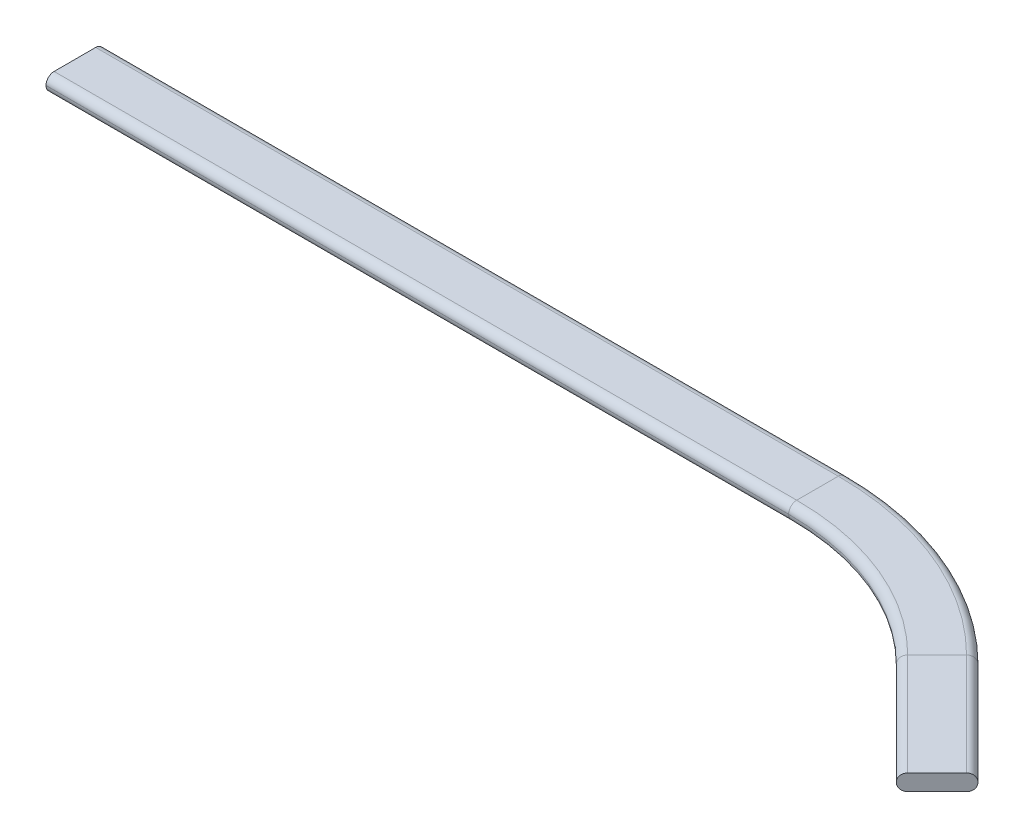
ISO-10303-21;
HEADER;
FILE_DESCRIPTION(('STEP AP214'),'2;1');
FILE_NAME('part.step','',(''),(''),'','','');
FILE_SCHEMA(('AUTOMOTIVE_DESIGN { 1 0 10303 214 1 1 1 1 }'));
ENDSEC;
DATA;
#1=APPLICATION_CONTEXT('core data for automotive mechanical design processes');
#2=APPLICATION_PROTOCOL_DEFINITION('international standard','automotive_design',2000,#1);
#3=PRODUCT_CONTEXT('',#1,'mechanical');
#4=PRODUCT('Part','Part','',(#3));
#5=PRODUCT_RELATED_PRODUCT_CATEGORY('part','',(#4));
#6=PRODUCT_DEFINITION_FORMATION('','',#4);
#7=PRODUCT_DEFINITION_CONTEXT('part definition',#1,'design');
#8=PRODUCT_DEFINITION('design','',#6,#7);
#9=PRODUCT_DEFINITION_SHAPE('','',#8);
#10=(LENGTH_UNIT() NAMED_UNIT(*) SI_UNIT(.MILLI.,.METRE.));
#11=(NAMED_UNIT(*) PLANE_ANGLE_UNIT() SI_UNIT($,.RADIAN.));
#12=(NAMED_UNIT(*) SI_UNIT($,.STERADIAN.) SOLID_ANGLE_UNIT());
#13=UNCERTAINTY_MEASURE_WITH_UNIT(LENGTH_MEASURE(1.E-05),#10,'distance_accuracy_value','');
#14=(GEOMETRIC_REPRESENTATION_CONTEXT(3) GLOBAL_UNCERTAINTY_ASSIGNED_CONTEXT((#13)) GLOBAL_UNIT_ASSIGNED_CONTEXT((#10,
#11,#12)) REPRESENTATION_CONTEXT('',''));
#15=CARTESIAN_POINT('',(0.,0.,0.));
#16=DIRECTION('',(0.,0.,1.));
#17=DIRECTION('',(1.,0.,0.));
#18=AXIS2_PLACEMENT_3D('',#15,#16,#17);
#19=CARTESIAN_POINT('',(0.,-1.495,-0.3));
#20=DIRECTION('',(0.,0.,1.));
#21=DIRECTION('',(1.,0.,0.));
#22=AXIS2_PLACEMENT_3D('',#19,#20,#21);
#23=CYLINDRICAL_SURFACE('',#22,0.5);
#24=CARTESIAN_POINT('',(0.,-1.495,0.3));
#25=DIRECTION('',(0.,0.,1.));
#26=DIRECTION('',(-1.,0.,0.));
#27=AXIS2_PLACEMENT_3D('',#24,#25,#26);
#28=CIRCLE('',#27,0.5);
#29=CARTESIAN_POINT('',(0.,-0.995,0.3));
#30=VERTEX_POINT('',#29);
#31=CARTESIAN_POINT('',(0.302042669776583,-1.89345981683758,0.3));
#32=VERTEX_POINT('',#31);
#33=EDGE_CURVE('E100',#30,#32,#28,.T.);
#34=ORIENTED_EDGE('',*,*,#33,.F.);
#35=DIRECTION('',(0.,0.,1.));
#36=VECTOR('',#35,1.);
#37=CARTESIAN_POINT('',(0.,-0.995,-0.3));
#38=LINE('',#37,#36);
#39=CARTESIAN_POINT('',(0.,-0.995,-0.3));
#40=VERTEX_POINT('',#39);
#41=EDGE_CURVE('E12',#40,#30,#38,.T.);
#42=ORIENTED_EDGE('',*,*,#41,.F.);
#43=CARTESIAN_POINT('',(0.,-1.495,-0.3));
#44=DIRECTION('',(0.,0.,1.));
#45=DIRECTION('',(-1.,0.,0.));
#46=AXIS2_PLACEMENT_3D('',#43,#44,#45);
#47=CIRCLE('',#46,0.5);
#48=CARTESIAN_POINT('',(0.302042669776583,-1.89345981683758,-0.3));
#49=VERTEX_POINT('',#48);
#50=EDGE_CURVE('E89',#40,#49,#47,.T.);
#51=ORIENTED_EDGE('',*,*,#50,.T.);
#52=DIRECTION('',(0.,0.,1.));
#53=VECTOR('',#52,1.);
#54=CARTESIAN_POINT('',(0.302042669776583,-1.89345981683758,-0.3));
#55=LINE('',#54,#53);
#56=EDGE_CURVE('E48',#49,#32,#55,.T.);
#57=ORIENTED_EDGE('',*,*,#56,.T.);
#58=EDGE_LOOP('',(#34,#42,#51,#57));
#59=FACE_BOUND('',#58,.T.);
#60=ADVANCED_FACE('F45',(#59),#23,.T.);
#61=CARTESIAN_POINT('',(1.48730611059384,-0.995,-0.3));
#62=DIRECTION('',(0.,1.,0.));
#63=DIRECTION('',(0.,0.,1.));
#64=AXIS2_PLACEMENT_3D('',#61,#62,#63);
#65=PLANE('',#64);
#66=DIRECTION('',(-1.,0.,0.));
#67=VECTOR('',#66,1.);
#68=CARTESIAN_POINT('',(1.48730611059384,-0.995,0.3));
#69=LINE('',#68,#67);
#70=CARTESIAN_POINT('',(1.48730611059384,-0.995,0.3));
#71=VERTEX_POINT('',#70);
#72=EDGE_CURVE('E91',#71,#30,#69,.T.);
#73=ORIENTED_EDGE('',*,*,#72,.F.);
#74=DIRECTION('',(0.,0.,1.));
#75=VECTOR('',#74,1.);
#76=CARTESIAN_POINT('',(1.48730611059384,-0.995,-0.3));
#77=LINE('',#76,#75);
#78=CARTESIAN_POINT('',(1.48730611059384,-0.995,-0.3));
#79=VERTEX_POINT('',#78);
#80=EDGE_CURVE('E54',#79,#71,#77,.T.);
#81=ORIENTED_EDGE('',*,*,#80,.F.);
#82=DIRECTION('',(-1.,0.,0.));
#83=VECTOR('',#82,1.);
#84=CARTESIAN_POINT('',(1.48730611059384,-0.995,-0.3));
#85=LINE('',#84,#83);
#86=EDGE_CURVE('E86',#79,#40,#85,.T.);
#87=ORIENTED_EDGE('',*,*,#86,.T.);
#88=ORIENTED_EDGE('',*,*,#41,.T.);
#89=EDGE_LOOP('',(#73,#81,#87,#88));
#90=FACE_BOUND('',#89,.T.);
#91=ADVANCED_FACE('F105',(#90),#65,.T.);
#92=CARTESIAN_POINT('',(0.302042669776583,-1.89345981683758,-0.3));
#93=DIRECTION('',(0.604085339553166,-0.796919633675151,0.));
#94=DIRECTION('',(0.796919633675151,0.604085339553166,0.));
#95=AXIS2_PLACEMENT_3D('',#92,#93,#94);
#96=PLANE('',#95);
#97=DIRECTION('',(0.796919633675151,0.604085339553166,0.));
#98=VECTOR('',#97,1.);
#99=CARTESIAN_POINT('',(0.302042669776583,-1.89345981683758,0.3));
#100=LINE('',#99,#98);
#101=EDGE_CURVE('E84',#32,#71,#100,.T.);
#102=ORIENTED_EDGE('',*,*,#101,.F.);
#103=ORIENTED_EDGE('',*,*,#56,.F.);
#104=DIRECTION('',(0.796919633675151,0.604085339553166,0.));
#105=VECTOR('',#104,1.);
#106=CARTESIAN_POINT('',(0.302042669776583,-1.89345981683758,-0.3));
#107=LINE('',#106,#105);
#108=EDGE_CURVE('E82',#49,#79,#107,.T.);
#109=ORIENTED_EDGE('',*,*,#108,.T.);
#110=ORIENTED_EDGE('',*,*,#80,.T.);
#111=EDGE_LOOP('',(#102,#103,#109,#110));
#112=FACE_BOUND('',#111,.T.);
#113=ADVANCED_FACE('F81',(#112),#96,.T.);
#114=CARTESIAN_POINT('',(0.,-1.495,-0.3));
#115=DIRECTION('',(0.,0.,-1.));
#116=DIRECTION('',(-1.,0.,0.));
#117=AXIS2_PLACEMENT_3D('',#114,#115,#116);
#118=PLANE('',#117);
#119=CARTESIAN_POINT('',(0.,-1.495,-0.3));
#120=DIRECTION('',(0.,0.,1.));
#121=DIRECTION('',(-1.,0.,0.));
#122=AXIS2_PLACEMENT_3D('',#119,#120,#121);
#123=CIRCLE('',#122,0.25);
#124=CARTESIAN_POINT('',(-0.25,-1.495,-0.3));
#125=VERTEX_POINT('',#124);
#126=EDGE_CURVE('E102',#125,#125,#123,.T.);
#127=ORIENTED_EDGE('',*,*,#126,.T.);
#128=EDGE_LOOP('',(#127));
#129=FACE_BOUND('',#128,.T.);
#130=ORIENTED_EDGE('',*,*,#50,.F.);
#131=ORIENTED_EDGE('',*,*,#86,.F.);
#132=ORIENTED_EDGE('',*,*,#108,.F.);
#133=EDGE_LOOP('',(#130,#131,#132));
#134=FACE_BOUND('',#133,.T.);
#135=ADVANCED_FACE('F88',(#129,#134),#118,.T.);
#136=CARTESIAN_POINT('',(0.,-1.495,0.3));
#137=DIRECTION('',(0.,0.,-1.));
#138=DIRECTION('',(-1.,0.,0.));
#139=AXIS2_PLACEMENT_3D('',#136,#137,#138);
#140=PLANE('',#139);
#141=CARTESIAN_POINT('',(0.,-1.495,0.3));
#142=DIRECTION('',(0.,0.,1.));
#143=DIRECTION('',(-1.,0.,0.));
#144=AXIS2_PLACEMENT_3D('',#141,#142,#143);
#145=CIRCLE('',#144,0.25);
#146=CARTESIAN_POINT('',(-0.25,-1.495,0.3));
#147=VERTEX_POINT('',#146);
#148=EDGE_CURVE('E96',#147,#147,#145,.T.);
#149=ORIENTED_EDGE('',*,*,#148,.F.);
#150=EDGE_LOOP('',(#149));
#151=FACE_BOUND('',#150,.T.);
#152=ORIENTED_EDGE('',*,*,#33,.T.);
#153=ORIENTED_EDGE('',*,*,#101,.T.);
#154=ORIENTED_EDGE('',*,*,#72,.T.);
#155=EDGE_LOOP('',(#152,#153,#154));
#156=FACE_BOUND('',#155,.T.);
#157=ADVANCED_FACE('F104',(#151,#156),#140,.F.);
#158=CARTESIAN_POINT('',(0.,-1.495,-0.3));
#159=DIRECTION('',(0.,0.,1.));
#160=DIRECTION('',(1.,0.,0.));
#161=AXIS2_PLACEMENT_3D('',#158,#159,#160);
#162=CYLINDRICAL_SURFACE('',#161,0.25);
#163=ORIENTED_EDGE('',*,*,#126,.F.);
#164=EDGE_LOOP('',(#163));
#165=FACE_BOUND('',#164,.T.);
#166=ORIENTED_EDGE('',*,*,#148,.T.);
#167=EDGE_LOOP('',(#166));
#168=FACE_BOUND('',#167,.T.);
#169=ADVANCED_FACE('F115',(#165,#168),#162,.F.);
#170=CLOSED_SHELL('',(#60,#91,#113,#135,#157,#169));
#171=MANIFOLD_SOLID_BREP('B2',#170);
#172=CARTESIAN_POINT('',(0.,0.,0.));
#173=DIRECTION('',(1.,0.,0.));
#174=DIRECTION('',(0.,0.,-1.));
#175=AXIS2_PLACEMENT_3D('',#172,#173,#174);
#176=PLANE('',#175);
#177=DIRECTION('',(0.,0.,-1.));
#178=VECTOR('',#177,1.);
#179=CARTESIAN_POINT('',(0.,-0.985,-3.5));
#180=LINE('',#179,#178);
#181=CARTESIAN_POINT('',(0.,-0.984999999999999,2.52));
#182=VERTEX_POINT('',#181);
#183=CARTESIAN_POINT('',(0.,-0.985,-2.52));
#184=VERTEX_POINT('',#183);
#185=EDGE_CURVE('E411',#182,#184,#180,.T.);
#186=ORIENTED_EDGE('',*,*,#185,.F.);
#187=CARTESIAN_POINT('',(0.,-0.0049999999999998,2.52));
#188=DIRECTION('',(1.,0.,0.));
#189=DIRECTION('',(0.,0.,-1.));
#190=AXIS2_PLACEMENT_3D('',#187,#188,#189);
#191=CIRCLE('',#190,0.98);
#192=CARTESIAN_POINT('',(0.,-0.0049999999999998,3.5));
#193=VERTEX_POINT('',#192);
#194=EDGE_CURVE('E359',#182,#193,#191,.F.);
#195=ORIENTED_EDGE('',*,*,#194,.T.);
#196=DIRECTION('',(0.,-1.,0.));
#197=VECTOR('',#196,1.);
#198=CARTESIAN_POINT('',(0.,-0.984999999999999,3.5));
#199=LINE('',#198,#197);
#200=CARTESIAN_POINT('',(0.,0.00500000000000045,3.5));
#201=VERTEX_POINT('',#200);
#202=EDGE_CURVE('E408',#201,#193,#199,.T.);
#203=ORIENTED_EDGE('',*,*,#202,.F.);
#204=CARTESIAN_POINT('',(0.,0.00500000000000045,2.52));
#205=DIRECTION('',(1.,0.,0.));
#206=DIRECTION('',(0.,0.,-1.));
#207=AXIS2_PLACEMENT_3D('',#204,#205,#206);
#208=CIRCLE('',#207,0.98);
#209=CARTESIAN_POINT('',(0.,0.985,2.52));
#210=VERTEX_POINT('',#209);
#211=EDGE_CURVE('E357',#201,#210,#208,.F.);
#212=ORIENTED_EDGE('',*,*,#211,.T.);
#213=DIRECTION('',(0.,0.,1.));
#214=VECTOR('',#213,1.);
#215=CARTESIAN_POINT('',(0.,0.985,-3.5));
#216=LINE('',#215,#214);
#217=CARTESIAN_POINT('',(0.,0.985,-2.52));
#218=VERTEX_POINT('',#217);
#219=EDGE_CURVE('E401',#218,#210,#216,.T.);
#220=ORIENTED_EDGE('',*,*,#219,.F.);
#221=CARTESIAN_POINT('',(0.,0.00500000000000023,-2.52));
#222=DIRECTION('',(1.,0.,0.));
#223=DIRECTION('',(0.,0.,-1.));
#224=AXIS2_PLACEMENT_3D('',#221,#222,#223);
#225=CIRCLE('',#224,0.98);
#226=CARTESIAN_POINT('',(0.,0.00500000000000023,-3.5));
#227=VERTEX_POINT('',#226);
#228=EDGE_CURVE('E181',#218,#227,#225,.F.);
#229=ORIENTED_EDGE('',*,*,#228,.T.);
#230=DIRECTION('',(0.,1.,0.));
#231=VECTOR('',#230,1.);
#232=CARTESIAN_POINT('',(0.,-0.985,-3.5));
#233=LINE('',#232,#231);
#234=CARTESIAN_POINT('',(0.,-0.00500000000000001,-3.5));
#235=VERTEX_POINT('',#234);
#236=EDGE_CURVE('E373',#235,#227,#233,.T.);
#237=ORIENTED_EDGE('',*,*,#236,.F.);
#238=CARTESIAN_POINT('',(0.,-0.00499999999999995,-2.52));
#239=DIRECTION('',(1.,0.,0.));
#240=DIRECTION('',(0.,0.,-1.));
#241=AXIS2_PLACEMENT_3D('',#238,#239,#240);
#242=CIRCLE('',#241,0.98);
#243=EDGE_CURVE('E355',#235,#184,#242,.F.);
#244=ORIENTED_EDGE('',*,*,#243,.T.);
#245=EDGE_LOOP('',(#186,#195,#203,#212,#220,#229,#237,#244));
#246=FACE_BOUND('',#245,.T.);
#247=ADVANCED_FACE('F164',(#246),#176,.F.);
#248=CARTESIAN_POINT('',(127.130929640481,0.,22.6334549574227));
#249=DIRECTION('',(0.707106781186547,0.,0.707106781186548));
#250=DIRECTION('',(0.707106781186548,0.,-0.707106781186547));
#251=AXIS2_PLACEMENT_3D('',#248,#249,#250);
#252=PLANE('',#251);
#253=DIRECTION('',(0.,-1.,0.));
#254=VECTOR('',#253,1.);
#255=CARTESIAN_POINT('',(124.656055906328,-0.984999999999999,25.1083286915756));
#256=LINE('',#255,#254);
#257=CARTESIAN_POINT('',(124.656055906328,0.00500000000000023,25.1083286915756));
#258=VERTEX_POINT('',#257);
#259=CARTESIAN_POINT('',(124.656055906328,-0.00499999999999936,25.1083286915756));
#260=VERTEX_POINT('',#259);
#261=EDGE_CURVE('E282',#258,#260,#256,.T.);
#262=ORIENTED_EDGE('',*,*,#261,.T.);
#263=CARTESIAN_POINT('',(125.349020551891,-0.00499999999999936,24.4153640460128));
#264=DIRECTION('',(0.707106781186547,0.,0.707106781186548));
#265=DIRECTION('',(0.707106781186548,0.,-0.707106781186547));
#266=AXIS2_PLACEMENT_3D('',#263,#264,#265);
#267=CIRCLE('',#266,0.98);
#268=CARTESIAN_POINT('',(125.349020551891,-0.984999999999999,24.4153640460128));
#269=VERTEX_POINT('',#268);
#270=EDGE_CURVE('E289',#260,#269,#267,.T.);
#271=ORIENTED_EDGE('',*,*,#270,.T.);
#272=DIRECTION('',(0.707106781186548,0.,-0.707106781186547));
#273=VECTOR('',#272,1.);
#274=CARTESIAN_POINT('',(129.605803374634,-0.985,20.1585812232697));
#275=LINE('',#274,#273);
#276=CARTESIAN_POINT('',(128.912838729071,-0.985,20.8515458688326));
#277=VERTEX_POINT('',#276);
#278=EDGE_CURVE('E300',#269,#277,#275,.T.);
#279=ORIENTED_EDGE('',*,*,#278,.T.);
#280=CARTESIAN_POINT('',(128.912838729071,-0.00499999999999974,20.8515458688326));
#281=DIRECTION('',(0.707106781186547,0.,0.707106781186548));
#282=DIRECTION('',(0.707106781186548,0.,-0.707106781186547));
#283=AXIS2_PLACEMENT_3D('',#280,#281,#282);
#284=CIRCLE('',#283,0.98);
#285=CARTESIAN_POINT('',(129.605803374634,-0.0049999999999998,20.1585812232697));
#286=VERTEX_POINT('',#285);
#287=EDGE_CURVE('E290',#277,#286,#284,.T.);
#288=ORIENTED_EDGE('',*,*,#287,.T.);
#289=DIRECTION('',(0.,1.,0.));
#290=VECTOR('',#289,1.);
#291=CARTESIAN_POINT('',(129.605803374634,-0.985,20.1585812232697));
#292=LINE('',#291,#290);
#293=CARTESIAN_POINT('',(129.605803374634,0.00500000000000023,20.1585812232697));
#294=VERTEX_POINT('',#293);
#295=EDGE_CURVE('E416',#286,#294,#292,.T.);
#296=ORIENTED_EDGE('',*,*,#295,.T.);
#297=CARTESIAN_POINT('',(128.912838729071,0.00500000000000023,20.8515458688326));
#298=DIRECTION('',(0.707106781186547,0.,0.707106781186548));
#299=DIRECTION('',(0.707106781186548,0.,-0.707106781186547));
#300=AXIS2_PLACEMENT_3D('',#297,#298,#299);
#301=CIRCLE('',#300,0.98);
#302=CARTESIAN_POINT('',(128.912838729071,0.985,20.8515458688326));
#303=VERTEX_POINT('',#302);
#304=EDGE_CURVE('E307',#294,#303,#301,.T.);
#305=ORIENTED_EDGE('',*,*,#304,.T.);
#306=DIRECTION('',(-0.707106781186548,0.,0.707106781186547));
#307=VECTOR('',#306,1.);
#308=CARTESIAN_POINT('',(129.605803374634,0.985,20.1585812232697));
#309=LINE('',#308,#307);
#310=CARTESIAN_POINT('',(125.349020551891,0.985,24.4153640460128));
#311=VERTEX_POINT('',#310);
#312=EDGE_CURVE('E284',#303,#311,#309,.T.);
#313=ORIENTED_EDGE('',*,*,#312,.T.);
#314=CARTESIAN_POINT('',(125.349020551891,0.00500000000000023,24.4153640460128));
#315=DIRECTION('',(0.707106781186547,0.,0.707106781186548));
#316=DIRECTION('',(0.707106781186548,0.,-0.707106781186547));
#317=AXIS2_PLACEMENT_3D('',#314,#315,#316);
#318=CIRCLE('',#317,0.98);
#319=EDGE_CURVE('E279',#311,#258,#318,.T.);
#320=ORIENTED_EDGE('',*,*,#319,.T.);
#321=EDGE_LOOP('',(#262,#271,#279,#288,#296,#305,#313,#320));
#322=FACE_BOUND('',#321,.T.);
#323=ADVANCED_FACE('F281',(#322),#252,.T.);
#324=CARTESIAN_POINT('',(0.,-0.985,-3.5));
#325=DIRECTION('',(0.,0.,-1.));
#326=DIRECTION('',(-1.,0.,0.));
#327=AXIS2_PLACEMENT_3D('',#324,#325,#326);
#328=PLANE('',#327);
#329=DIRECTION('',(0.,1.,0.));
#330=VECTOR('',#329,1.);
#331=CARTESIAN_POINT('',(90.,-0.985,-3.5));
#332=LINE('',#331,#330);
#333=CARTESIAN_POINT('',(90.,-0.00500000000000001,-3.5));
#334=VERTEX_POINT('',#333);
#335=CARTESIAN_POINT('',(90.,0.00500000000000023,-3.5));
#336=VERTEX_POINT('',#335);
#337=EDGE_CURVE('E420',#334,#336,#332,.T.);
#338=ORIENTED_EDGE('',*,*,#337,.F.);
#339=DIRECTION('',(1.,0.,0.));
#340=VECTOR('',#339,1.);
#341=CARTESIAN_POINT('',(0.,-0.00500000000000001,-3.5));
#342=LINE('',#341,#340);
#343=EDGE_CURVE('E43',#334,#235,#342,.F.);
#344=ORIENTED_EDGE('',*,*,#343,.T.);
#345=ORIENTED_EDGE('',*,*,#236,.T.);
#346=DIRECTION('',(1.,0.,0.));
#347=VECTOR('',#346,1.);
#348=CARTESIAN_POINT('',(0.,0.00500000000000023,-3.5));
#349=LINE('',#348,#347);
#350=EDGE_CURVE('E173',#227,#336,#349,.T.);
#351=ORIENTED_EDGE('',*,*,#350,.T.);
#352=EDGE_LOOP('',(#338,#344,#345,#351));
#353=FACE_BOUND('',#352,.T.);
#354=ADVANCED_FACE('F457',(#353),#328,.T.);
#355=CARTESIAN_POINT('',(0.,0.985,-3.5));
#356=DIRECTION('',(0.,1.,0.));
#357=DIRECTION('',(0.,0.,1.));
#358=AXIS2_PLACEMENT_3D('',#355,#356,#357);
#359=PLANE('',#358);
#360=ORIENTED_EDGE('',*,*,#219,.T.);
#361=DIRECTION('',(1.,0.,0.));
#362=VECTOR('',#361,1.);
#363=CARTESIAN_POINT('',(0.,0.985,2.52));
#364=LINE('',#363,#362);
#365=CARTESIAN_POINT('',(90.,0.985,2.52));
#366=VERTEX_POINT('',#365);
#367=EDGE_CURVE('E363',#210,#366,#364,.T.);
#368=ORIENTED_EDGE('',*,*,#367,.T.);
#369=DIRECTION('',(0.,0.,1.));
#370=VECTOR('',#369,1.);
#371=CARTESIAN_POINT('',(90.,0.985,-3.5));
#372=LINE('',#371,#370);
#373=CARTESIAN_POINT('',(90.,0.985,-2.52));
#374=VERTEX_POINT('',#373);
#375=EDGE_CURVE('E404',#374,#366,#372,.T.);
#376=ORIENTED_EDGE('',*,*,#375,.F.);
#377=DIRECTION('',(1.,0.,0.));
#378=VECTOR('',#377,1.);
#379=CARTESIAN_POINT('',(0.,0.985,-2.52));
#380=LINE('',#379,#378);
#381=EDGE_CURVE('E361',#374,#218,#380,.F.);
#382=ORIENTED_EDGE('',*,*,#381,.T.);
#383=EDGE_LOOP('',(#360,#368,#376,#382));
#384=FACE_BOUND('',#383,.T.);
#385=ADVANCED_FACE('F400',(#384),#359,.T.);
#386=CARTESIAN_POINT('',(0.,-0.984999999999999,3.5));
#387=DIRECTION('',(0.,0.,1.));
#388=DIRECTION('',(1.,0.,0.));
#389=AXIS2_PLACEMENT_3D('',#386,#387,#388);
#390=PLANE('',#389);
#391=ORIENTED_EDGE('',*,*,#202,.T.);
#392=DIRECTION('',(1.,0.,0.));
#393=VECTOR('',#392,1.);
#394=CARTESIAN_POINT('',(0.,-0.0049999999999998,3.5));
#395=LINE('',#394,#393);
#396=CARTESIAN_POINT('',(90.,-0.0049999999999998,3.5));
#397=VERTEX_POINT('',#396);
#398=EDGE_CURVE('E348',#193,#397,#395,.T.);
#399=ORIENTED_EDGE('',*,*,#398,.T.);
#400=DIRECTION('',(0.,-1.,0.));
#401=VECTOR('',#400,1.);
#402=CARTESIAN_POINT('',(90.,-0.984999999999999,3.5));
#403=LINE('',#402,#401);
#404=CARTESIAN_POINT('',(90.,0.00500000000000045,3.5));
#405=VERTEX_POINT('',#404);
#406=EDGE_CURVE('E419',#405,#397,#403,.T.);
#407=ORIENTED_EDGE('',*,*,#406,.F.);
#408=DIRECTION('',(1.,0.,0.));
#409=VECTOR('',#408,1.);
#410=CARTESIAN_POINT('',(0.,0.00500000000000045,3.5));
#411=LINE('',#410,#409);
#412=EDGE_CURVE('E346',#405,#201,#411,.F.);
#413=ORIENTED_EDGE('',*,*,#412,.T.);
#414=EDGE_LOOP('',(#391,#399,#407,#413));
#415=FACE_BOUND('',#414,.T.);
#416=ADVANCED_FACE('F483',(#415),#390,.T.);
#417=CARTESIAN_POINT('',(0.,-0.985,-3.5));
#418=DIRECTION('',(0.,-1.,0.));
#419=DIRECTION('',(0.,0.,-1.));
#420=AXIS2_PLACEMENT_3D('',#417,#418,#419);
#421=PLANE('',#420);
#422=DIRECTION('',(0.,0.,-1.));
#423=VECTOR('',#422,1.);
#424=CARTESIAN_POINT('',(90.,-0.985,-3.5));
#425=LINE('',#424,#423);
#426=CARTESIAN_POINT('',(90.,-0.984999999999999,2.52));
#427=VERTEX_POINT('',#426);
#428=CARTESIAN_POINT('',(90.,-0.985,-2.52));
#429=VERTEX_POINT('',#428);
#430=EDGE_CURVE('E429',#427,#429,#425,.T.);
#431=ORIENTED_EDGE('',*,*,#430,.F.);
#432=DIRECTION('',(1.,0.,0.));
#433=VECTOR('',#432,1.);
#434=CARTESIAN_POINT('',(0.,-0.984999999999999,2.52));
#435=LINE('',#434,#433);
#436=EDGE_CURVE('E352',#427,#182,#435,.F.);
#437=ORIENTED_EDGE('',*,*,#436,.T.);
#438=ORIENTED_EDGE('',*,*,#185,.T.);
#439=DIRECTION('',(1.,0.,0.));
#440=VECTOR('',#439,1.);
#441=CARTESIAN_POINT('',(0.,-0.985,-2.52));
#442=LINE('',#441,#440);
#443=EDGE_CURVE('E350',#184,#429,#442,.T.);
#444=ORIENTED_EDGE('',*,*,#443,.T.);
#445=EDGE_LOOP('',(#431,#437,#438,#444));
#446=FACE_BOUND('',#445,.T.);
#447=ADVANCED_FACE('F466',(#446),#421,.T.);
#448=CARTESIAN_POINT('',(90.,0.,35.));
#449=DIRECTION('',(0.,-1.,0.));
#450=DIRECTION('',(0.,0.,-1.));
#451=AXIS2_PLACEMENT_3D('',#448,#449,#450);
#452=CYLINDRICAL_SURFACE('',#451,38.5);
#453=DIRECTION('',(0.,1.,0.));
#454=VECTOR('',#453,1.);
#455=CARTESIAN_POINT('',(117.223611075682,-0.985,7.77638892431797));
#456=LINE('',#455,#454);
#457=CARTESIAN_POINT('',(117.223611075682,-0.00499999999999958,7.77638892431797));
#458=VERTEX_POINT('',#457);
#459=CARTESIAN_POINT('',(117.223611075682,0.00500000000000023,7.77638892431797));
#460=VERTEX_POINT('',#459);
#461=EDGE_CURVE('E425',#458,#460,#456,.T.);
#462=ORIENTED_EDGE('',*,*,#461,.F.);
#463=CARTESIAN_POINT('',(90.,-0.00499999999999958,35.));
#464=DIRECTION('',(0.,-1.,0.));
#465=DIRECTION('',(0.,0.,-1.));
#466=AXIS2_PLACEMENT_3D('',#463,#464,#465);
#467=CIRCLE('',#466,38.5);
#468=EDGE_CURVE('E344',#458,#334,#467,.F.);
#469=ORIENTED_EDGE('',*,*,#468,.T.);
#470=ORIENTED_EDGE('',*,*,#337,.T.);
#471=CARTESIAN_POINT('',(90.,0.00500000000000023,35.));
#472=DIRECTION('',(0.,1.,0.));
#473=DIRECTION('',(0.,0.,1.));
#474=AXIS2_PLACEMENT_3D('',#471,#472,#473);
#475=CIRCLE('',#474,38.5);
#476=EDGE_CURVE('E342',#336,#460,#475,.F.);
#477=ORIENTED_EDGE('',*,*,#476,.T.);
#478=EDGE_LOOP('',(#462,#469,#470,#477));
#479=FACE_BOUND('',#478,.T.);
#480=ADVANCED_FACE('F456',(#479),#452,.T.);
#481=CARTESIAN_POINT('',(90.,0.985,-3.5));
#482=DIRECTION('',(0.,1.,0.));
#483=DIRECTION('',(0.,0.,1.));
#484=AXIS2_PLACEMENT_3D('',#481,#482,#483);
#485=PLANE('',#484);
#486=ORIENTED_EDGE('',*,*,#375,.T.);
#487=CARTESIAN_POINT('',(90.,0.985,35.));
#488=DIRECTION('',(0.,1.,0.));
#489=DIRECTION('',(0.,0.,1.));
#490=AXIS2_PLACEMENT_3D('',#487,#488,#489);
#491=CIRCLE('',#490,32.48);
#492=CARTESIAN_POINT('',(112.966828252939,0.985,12.033171747061));
#493=VERTEX_POINT('',#492);
#494=EDGE_CURVE('E335',#366,#493,#491,.F.);
#495=ORIENTED_EDGE('',*,*,#494,.T.);
#496=DIRECTION('',(-0.707106781186549,0.,0.707106781186546));
#497=VECTOR('',#496,1.);
#498=CARTESIAN_POINT('',(117.223611075682,0.985,7.77638892431797));
#499=LINE('',#498,#497);
#500=CARTESIAN_POINT('',(116.530646430119,0.985,8.46935356988078));
#501=VERTEX_POINT('',#500);
#502=EDGE_CURVE('E421',#501,#493,#499,.T.);
#503=ORIENTED_EDGE('',*,*,#502,.F.);
#504=CARTESIAN_POINT('',(90.,0.985,35.));
#505=DIRECTION('',(0.,1.,0.));
#506=DIRECTION('',(0.,0.,1.));
#507=AXIS2_PLACEMENT_3D('',#504,#505,#506);
#508=CIRCLE('',#507,37.52);
#509=EDGE_CURVE('E333',#501,#374,#508,.T.);
#510=ORIENTED_EDGE('',*,*,#509,.T.);
#511=EDGE_LOOP('',(#486,#495,#503,#510));
#512=FACE_BOUND('',#511,.T.);
#513=ADVANCED_FACE('F492',(#512),#485,.T.);
#514=CARTESIAN_POINT('',(90.,0.,35.));
#515=DIRECTION('',(0.,-1.,0.));
#516=DIRECTION('',(0.,0.,-1.));
#517=AXIS2_PLACEMENT_3D('',#514,#515,#516);
#518=CYLINDRICAL_SURFACE('',#517,31.5);
#519=ORIENTED_EDGE('',*,*,#406,.T.);
#520=CARTESIAN_POINT('',(90.,-0.00499999999999958,35.));
#521=DIRECTION('',(0.,-1.,0.));
#522=DIRECTION('',(0.,0.,-1.));
#523=AXIS2_PLACEMENT_3D('',#520,#521,#522);
#524=CIRCLE('',#523,31.5);
#525=CARTESIAN_POINT('',(112.273863607376,-0.00499999999999958,12.7261363926238));
#526=VERTEX_POINT('',#525);
#527=EDGE_CURVE('E323',#397,#526,#524,.T.);
#528=ORIENTED_EDGE('',*,*,#527,.T.);
#529=DIRECTION('',(0.,-1.,0.));
#530=VECTOR('',#529,1.);
#531=CARTESIAN_POINT('',(112.273863607376,-0.984999999999999,12.7261363926238));
#532=LINE('',#531,#530);
#533=CARTESIAN_POINT('',(112.273863607376,0.00500000000000023,12.7261363926238));
#534=VERTEX_POINT('',#533);
#535=EDGE_CURVE('E424',#534,#526,#532,.T.);
#536=ORIENTED_EDGE('',*,*,#535,.F.);
#537=CARTESIAN_POINT('',(90.,0.00500000000000023,35.));
#538=DIRECTION('',(0.,1.,0.));
#539=DIRECTION('',(0.,0.,1.));
#540=AXIS2_PLACEMENT_3D('',#537,#538,#539);
#541=CIRCLE('',#540,31.5);
#542=EDGE_CURVE('E321',#534,#405,#541,.T.);
#543=ORIENTED_EDGE('',*,*,#542,.T.);
#544=EDGE_LOOP('',(#519,#528,#536,#543));
#545=FACE_BOUND('',#544,.T.);
#546=ADVANCED_FACE('F478',(#545),#518,.F.);
#547=CARTESIAN_POINT('',(90.,-0.985,-3.5));
#548=DIRECTION('',(0.,-1.,0.));
#549=DIRECTION('',(0.,0.,-1.));
#550=AXIS2_PLACEMENT_3D('',#547,#548,#549);
#551=PLANE('',#550);
#552=DIRECTION('',(0.707106781186549,0.,-0.707106781186546));
#553=VECTOR('',#552,1.);
#554=CARTESIAN_POINT('',(117.223611075682,-0.985,7.77638892431797));
#555=LINE('',#554,#553);
#556=CARTESIAN_POINT('',(112.966828252939,-0.984999999999999,12.033171747061));
#557=VERTEX_POINT('',#556);
#558=CARTESIAN_POINT('',(116.530646430119,-0.985,8.46935356988078));
#559=VERTEX_POINT('',#558);
#560=EDGE_CURVE('E430',#557,#559,#555,.T.);
#561=ORIENTED_EDGE('',*,*,#560,.F.);
#562=CARTESIAN_POINT('',(90.,-0.985,35.));
#563=DIRECTION('',(0.,-1.,0.));
#564=DIRECTION('',(0.,0.,-1.));
#565=AXIS2_PLACEMENT_3D('',#562,#563,#564);
#566=CIRCLE('',#565,32.48);
#567=EDGE_CURVE('E327',#557,#427,#566,.F.);
#568=ORIENTED_EDGE('',*,*,#567,.T.);
#569=ORIENTED_EDGE('',*,*,#430,.T.);
#570=CARTESIAN_POINT('',(90.,-0.985,35.));
#571=DIRECTION('',(0.,-1.,0.));
#572=DIRECTION('',(0.,0.,-1.));
#573=AXIS2_PLACEMENT_3D('',#570,#571,#572);
#574=CIRCLE('',#573,37.52);
#575=EDGE_CURVE('E325',#429,#559,#574,.T.);
#576=ORIENTED_EDGE('',*,*,#575,.T.);
#577=EDGE_LOOP('',(#561,#568,#569,#576));
#578=FACE_BOUND('',#577,.T.);
#579=ADVANCED_FACE('F514',(#578),#551,.T.);
#580=CARTESIAN_POINT('',(117.223611075682,-0.985,7.77638892431797));
#581=DIRECTION('',(0.707106781186548,0.,-0.707106781186547));
#582=DIRECTION('',(-0.707106781186547,0.,-0.707106781186548));
#583=AXIS2_PLACEMENT_3D('',#580,#581,#582);
#584=PLANE('',#583);
#585=ORIENTED_EDGE('',*,*,#295,.F.);
#586=DIRECTION('',(0.707106781186547,0.,0.707106781186548));
#587=VECTOR('',#586,1.);
#588=CARTESIAN_POINT('',(117.223611075682,-0.0049999999999998,7.77638892431797));
#589=LINE('',#588,#587);
#590=EDGE_CURVE('E340',#286,#458,#589,.F.);
#591=ORIENTED_EDGE('',*,*,#590,.T.);
#592=ORIENTED_EDGE('',*,*,#461,.T.);
#593=DIRECTION('',(0.707106781186547,0.,0.707106781186548));
#594=VECTOR('',#593,1.);
#595=CARTESIAN_POINT('',(117.223611075682,0.00500000000000023,7.77638892431797));
#596=LINE('',#595,#594);
#597=EDGE_CURVE('E337',#460,#294,#596,.T.);
#598=ORIENTED_EDGE('',*,*,#597,.T.);
#599=EDGE_LOOP('',(#585,#591,#592,#598));
#600=FACE_BOUND('',#599,.T.);
#601=ADVANCED_FACE('F443',(#600),#584,.T.);
#602=CARTESIAN_POINT('',(117.223611075682,0.985,7.77638892431797));
#603=DIRECTION('',(0.,1.,0.));
#604=DIRECTION('',(0.,0.,1.));
#605=AXIS2_PLACEMENT_3D('',#602,#603,#604);
#606=PLANE('',#605);
#607=ORIENTED_EDGE('',*,*,#502,.T.);
#608=DIRECTION('',(0.707106781186547,0.,0.707106781186548));
#609=VECTOR('',#608,1.);
#610=CARTESIAN_POINT('',(112.966828252939,0.985,12.033171747061));
#611=LINE('',#610,#609);
#612=EDGE_CURVE('E331',#493,#311,#611,.T.);
#613=ORIENTED_EDGE('',*,*,#612,.T.);
#614=ORIENTED_EDGE('',*,*,#312,.F.);
#615=DIRECTION('',(0.707106781186547,0.,0.707106781186548));
#616=VECTOR('',#615,1.);
#617=CARTESIAN_POINT('',(116.530646430119,0.985,8.46935356988078));
#618=LINE('',#617,#616);
#619=EDGE_CURVE('E329',#303,#501,#618,.F.);
#620=ORIENTED_EDGE('',*,*,#619,.T.);
#621=EDGE_LOOP('',(#607,#613,#614,#620));
#622=FACE_BOUND('',#621,.T.);
#623=ADVANCED_FACE('F494',(#622),#606,.T.);
#624=CARTESIAN_POINT('',(112.273863607376,-0.984999999999999,12.7261363926238));
#625=DIRECTION('',(-0.707106781186548,0.,0.707106781186547));
#626=DIRECTION('',(0.707106781186547,0.,0.707106781186548));
#627=AXIS2_PLACEMENT_3D('',#624,#625,#626);
#628=PLANE('',#627);
#629=ORIENTED_EDGE('',*,*,#535,.T.);
#630=DIRECTION('',(0.707106781186547,0.,0.707106781186548));
#631=VECTOR('',#630,1.);
#632=CARTESIAN_POINT('',(112.273863607376,-0.00499999999999936,12.7261363926238));
#633=LINE('',#632,#631);
#634=EDGE_CURVE('E299',#526,#260,#633,.T.);
#635=ORIENTED_EDGE('',*,*,#634,.T.);
#636=ORIENTED_EDGE('',*,*,#261,.F.);
#637=DIRECTION('',(0.707106781186547,0.,0.707106781186548));
#638=VECTOR('',#637,1.);
#639=CARTESIAN_POINT('',(112.273863607376,0.00500000000000023,12.7261363926238));
#640=LINE('',#639,#638);
#641=EDGE_CURVE('E296',#258,#534,#640,.F.);
#642=ORIENTED_EDGE('',*,*,#641,.T.);
#643=EDGE_LOOP('',(#629,#635,#636,#642));
#644=FACE_BOUND('',#643,.T.);
#645=ADVANCED_FACE('F295',(#644),#628,.T.);
#646=CARTESIAN_POINT('',(117.223611075682,-0.985,7.77638892431797));
#647=DIRECTION('',(0.,-1.,0.));
#648=DIRECTION('',(1.,0.,0.));
#649=AXIS2_PLACEMENT_3D('',#646,#647,#648);
#650=PLANE('',#649);
#651=ORIENTED_EDGE('',*,*,#278,.F.);
#652=DIRECTION('',(0.707106781186547,0.,0.707106781186548));
#653=VECTOR('',#652,1.);
#654=CARTESIAN_POINT('',(112.966828252939,-0.984999999999999,12.033171747061));
#655=LINE('',#654,#653);
#656=EDGE_CURVE('E319',#269,#557,#655,.F.);
#657=ORIENTED_EDGE('',*,*,#656,.T.);
#658=ORIENTED_EDGE('',*,*,#560,.T.);
#659=DIRECTION('',(0.707106781186547,0.,0.707106781186548));
#660=VECTOR('',#659,1.);
#661=CARTESIAN_POINT('',(116.530646430119,-0.985,8.46935356988078));
#662=LINE('',#661,#660);
#663=EDGE_CURVE('E316',#559,#277,#662,.T.);
#664=ORIENTED_EDGE('',*,*,#663,.T.);
#665=EDGE_LOOP('',(#651,#657,#658,#664));
#666=FACE_BOUND('',#665,.T.);
#667=ADVANCED_FACE('F502',(#666),#650,.T.);
#668=CARTESIAN_POINT('',(0.,-0.0049999999999998,2.52));
#669=DIRECTION('',(1.,0.,0.));
#670=DIRECTION('',(0.,0.,-1.));
#671=AXIS2_PLACEMENT_3D('',#668,#669,#670);
#672=CYLINDRICAL_SURFACE('',#671,0.98);
#673=ORIENTED_EDGE('',*,*,#194,.F.);
#674=ORIENTED_EDGE('',*,*,#436,.F.);
#675=CARTESIAN_POINT('',(90.,-0.0049999999999998,2.52));
#676=DIRECTION('',(1.,0.,0.));
#677=DIRECTION('',(0.,0.,-1.));
#678=AXIS2_PLACEMENT_3D('',#675,#676,#677);
#679=CIRCLE('',#678,0.98);
#680=EDGE_CURVE('E369',#397,#427,#679,.T.);
#681=ORIENTED_EDGE('',*,*,#680,.F.);
#682=ORIENTED_EDGE('',*,*,#398,.F.);
#683=EDGE_LOOP('',(#673,#674,#681,#682));
#684=FACE_BOUND('',#683,.T.);
#685=ADVANCED_FACE('F470',(#684),#672,.T.);
#686=CARTESIAN_POINT('',(90.,-0.00499999999999958,35.));
#687=DIRECTION('',(0.,-1.,0.));
#688=DIRECTION('',(0.,0.,-1.));
#689=AXIS2_PLACEMENT_3D('',#686,#687,#688);
#690=TOROIDAL_SURFACE('',#689,32.48,0.98);
#691=ORIENTED_EDGE('',*,*,#680,.T.);
#692=ORIENTED_EDGE('',*,*,#567,.F.);
#693=CARTESIAN_POINT('',(112.966828252939,-0.00499999999999958,12.033171747061));
#694=DIRECTION('',(0.707106781186548,0.,0.707106781186548));
#695=DIRECTION('',(0.707106781186548,0.,-0.707106781186548));
#696=AXIS2_PLACEMENT_3D('',#693,#694,#695);
#697=CIRCLE('',#696,0.98);
#698=EDGE_CURVE('E366',#526,#557,#697,.T.);
#699=ORIENTED_EDGE('',*,*,#698,.F.);
#700=ORIENTED_EDGE('',*,*,#527,.F.);
#701=EDGE_LOOP('',(#691,#692,#699,#700));
#702=FACE_BOUND('',#701,.T.);
#703=ADVANCED_FACE('F475',(#702),#690,.T.);
#704=CARTESIAN_POINT('',(112.966828252939,-0.00499999999999936,12.033171747061));
#705=DIRECTION('',(0.707106781186547,0.,0.707106781186548));
#706=DIRECTION('',(0.707106781186548,0.,-0.707106781186547));
#707=AXIS2_PLACEMENT_3D('',#704,#705,#706);
#708=CYLINDRICAL_SURFACE('',#707,0.98);
#709=ORIENTED_EDGE('',*,*,#698,.T.);
#710=ORIENTED_EDGE('',*,*,#656,.F.);
#711=ORIENTED_EDGE('',*,*,#270,.F.);
#712=ORIENTED_EDGE('',*,*,#634,.F.);
#713=EDGE_LOOP('',(#709,#710,#711,#712));
#714=FACE_BOUND('',#713,.T.);
#715=ADVANCED_FACE('F520',(#714),#708,.T.);
#716=CARTESIAN_POINT('',(0.,0.00500000000000045,2.52));
#717=DIRECTION('',(1.,0.,0.));
#718=DIRECTION('',(0.,0.,-1.));
#719=AXIS2_PLACEMENT_3D('',#716,#717,#718);
#720=CYLINDRICAL_SURFACE('',#719,0.98);
#721=ORIENTED_EDGE('',*,*,#211,.F.);
#722=ORIENTED_EDGE('',*,*,#412,.F.);
#723=CARTESIAN_POINT('',(90.,0.00500000000000023,2.52));
#724=DIRECTION('',(1.,0.,0.));
#725=DIRECTION('',(0.,0.,-1.));
#726=AXIS2_PLACEMENT_3D('',#723,#724,#725);
#727=CIRCLE('',#726,0.98);
#728=EDGE_CURVE('E370',#366,#405,#727,.T.);
#729=ORIENTED_EDGE('',*,*,#728,.F.);
#730=ORIENTED_EDGE('',*,*,#367,.F.);
#731=EDGE_LOOP('',(#721,#722,#729,#730));
#732=FACE_BOUND('',#731,.T.);
#733=ADVANCED_FACE('F486',(#732),#720,.T.);
#734=CARTESIAN_POINT('',(90.,0.00500000000000023,35.));
#735=DIRECTION('',(0.,1.,0.));
#736=DIRECTION('',(0.,0.,1.));
#737=AXIS2_PLACEMENT_3D('',#734,#735,#736);
#738=TOROIDAL_SURFACE('',#737,32.48,0.98);
#739=ORIENTED_EDGE('',*,*,#728,.T.);
#740=ORIENTED_EDGE('',*,*,#542,.F.);
#741=CARTESIAN_POINT('',(112.966828252939,0.00500000000000023,12.033171747061));
#742=DIRECTION('',(0.707106781186547,0.,0.707106781186548));
#743=DIRECTION('',(0.707106781186548,0.,-0.707106781186547));
#744=AXIS2_PLACEMENT_3D('',#741,#742,#743);
#745=CIRCLE('',#744,0.98);
#746=EDGE_CURVE('E305',#493,#534,#745,.T.);
#747=ORIENTED_EDGE('',*,*,#746,.F.);
#748=ORIENTED_EDGE('',*,*,#494,.F.);
#749=EDGE_LOOP('',(#739,#740,#747,#748));
#750=FACE_BOUND('',#749,.T.);
#751=ADVANCED_FACE('F489',(#750),#738,.T.);
#752=CARTESIAN_POINT('',(112.966828252939,0.00500000000000023,12.033171747061));
#753=DIRECTION('',(0.707106781186547,0.,0.707106781186548));
#754=DIRECTION('',(0.707106781186548,0.,-0.707106781186547));
#755=AXIS2_PLACEMENT_3D('',#752,#753,#754);
#756=CYLINDRICAL_SURFACE('',#755,0.98);
#757=ORIENTED_EDGE('',*,*,#746,.T.);
#758=ORIENTED_EDGE('',*,*,#641,.F.);
#759=ORIENTED_EDGE('',*,*,#319,.F.);
#760=ORIENTED_EDGE('',*,*,#612,.F.);
#761=EDGE_LOOP('',(#757,#758,#759,#760));
#762=FACE_BOUND('',#761,.T.);
#763=ADVANCED_FACE('F303',(#762),#756,.T.);
#764=CARTESIAN_POINT('',(0.,-0.00499999999999995,-2.52));
#765=DIRECTION('',(1.,0.,0.));
#766=DIRECTION('',(0.,0.,-1.));
#767=AXIS2_PLACEMENT_3D('',#764,#765,#766);
#768=CYLINDRICAL_SURFACE('',#767,0.98);
#769=ORIENTED_EDGE('',*,*,#243,.F.);
#770=ORIENTED_EDGE('',*,*,#343,.F.);
#771=CARTESIAN_POINT('',(90.,-0.0049999999999998,-2.52));
#772=DIRECTION('',(1.,0.,0.));
#773=DIRECTION('',(0.,0.,-1.));
#774=AXIS2_PLACEMENT_3D('',#771,#772,#773);
#775=CIRCLE('',#774,0.98);
#776=EDGE_CURVE('E375',#429,#334,#775,.T.);
#777=ORIENTED_EDGE('',*,*,#776,.F.);
#778=ORIENTED_EDGE('',*,*,#443,.F.);
#779=EDGE_LOOP('',(#769,#770,#777,#778));
#780=FACE_BOUND('',#779,.T.);
#781=ADVANCED_FACE('F461',(#780),#768,.T.);
#782=CARTESIAN_POINT('',(90.,-0.00499999999999958,35.));
#783=DIRECTION('',(0.,-1.,0.));
#784=DIRECTION('',(0.,0.,-1.));
#785=AXIS2_PLACEMENT_3D('',#782,#783,#784);
#786=TOROIDAL_SURFACE('',#785,37.52,0.98);
#787=ORIENTED_EDGE('',*,*,#776,.T.);
#788=ORIENTED_EDGE('',*,*,#468,.F.);
#789=CARTESIAN_POINT('',(116.530646430119,-0.0049999999999998,8.46935356988078));
#790=DIRECTION('',(0.707106781186547,0.,0.707106781186548));
#791=DIRECTION('',(0.707106781186548,0.,-0.707106781186547));
#792=AXIS2_PLACEMENT_3D('',#789,#790,#791);
#793=CIRCLE('',#792,0.98);
#794=EDGE_CURVE('E378',#559,#458,#793,.T.);
#795=ORIENTED_EDGE('',*,*,#794,.F.);
#796=ORIENTED_EDGE('',*,*,#575,.F.);
#797=EDGE_LOOP('',(#787,#788,#795,#796));
#798=FACE_BOUND('',#797,.T.);
#799=ADVANCED_FACE('F452',(#798),#786,.T.);
#800=CARTESIAN_POINT('',(116.530646430119,-0.00499999999999974,8.46935356988078));
#801=DIRECTION('',(0.707106781186547,0.,0.707106781186548));
#802=DIRECTION('',(0.707106781186548,0.,-0.707106781186547));
#803=AXIS2_PLACEMENT_3D('',#800,#801,#802);
#804=CYLINDRICAL_SURFACE('',#803,0.98);
#805=ORIENTED_EDGE('',*,*,#794,.T.);
#806=ORIENTED_EDGE('',*,*,#590,.F.);
#807=ORIENTED_EDGE('',*,*,#287,.F.);
#808=ORIENTED_EDGE('',*,*,#663,.F.);
#809=EDGE_LOOP('',(#805,#806,#807,#808));
#810=FACE_BOUND('',#809,.T.);
#811=ADVANCED_FACE('F447',(#810),#804,.T.);
#812=CARTESIAN_POINT('',(0.,0.00500000000000023,-2.52));
#813=DIRECTION('',(1.,0.,0.));
#814=DIRECTION('',(0.,0.,-1.));
#815=AXIS2_PLACEMENT_3D('',#812,#813,#814);
#816=CYLINDRICAL_SURFACE('',#815,0.98);
#817=ORIENTED_EDGE('',*,*,#228,.F.);
#818=ORIENTED_EDGE('',*,*,#381,.F.);
#819=CARTESIAN_POINT('',(90.,0.00500000000000023,-2.52));
#820=DIRECTION('',(1.,0.,0.));
#821=DIRECTION('',(0.,0.,-1.));
#822=AXIS2_PLACEMENT_3D('',#819,#820,#821);
#823=CIRCLE('',#822,0.98);
#824=EDGE_CURVE('E168',#336,#374,#823,.T.);
#825=ORIENTED_EDGE('',*,*,#824,.F.);
#826=ORIENTED_EDGE('',*,*,#350,.F.);
#827=EDGE_LOOP('',(#817,#818,#825,#826));
#828=FACE_BOUND('',#827,.T.);
#829=ADVANCED_FACE('F166',(#828),#816,.T.);
#830=CARTESIAN_POINT('',(90.,0.00500000000000023,35.));
#831=DIRECTION('',(0.,1.,0.));
#832=DIRECTION('',(0.,0.,1.));
#833=AXIS2_PLACEMENT_3D('',#830,#831,#832);
#834=TOROIDAL_SURFACE('',#833,37.52,0.98);
#835=ORIENTED_EDGE('',*,*,#824,.T.);
#836=ORIENTED_EDGE('',*,*,#509,.F.);
#837=CARTESIAN_POINT('',(116.530646430119,0.00500000000000023,8.46935356988079));
#838=DIRECTION('',(0.707106781186548,0.,0.707106781186548));
#839=DIRECTION('',(0.707106781186548,0.,-0.707106781186548));
#840=AXIS2_PLACEMENT_3D('',#837,#838,#839);
#841=CIRCLE('',#840,0.98);
#842=EDGE_CURVE('E382',#460,#501,#841,.T.);
#843=ORIENTED_EDGE('',*,*,#842,.F.);
#844=ORIENTED_EDGE('',*,*,#476,.F.);
#845=EDGE_LOOP('',(#835,#836,#843,#844));
#846=FACE_BOUND('',#845,.T.);
#847=ADVANCED_FACE('F393',(#846),#834,.T.);
#848=CARTESIAN_POINT('',(116.530646430119,0.00500000000000023,8.46935356988078));
#849=DIRECTION('',(0.707106781186547,0.,0.707106781186548));
#850=DIRECTION('',(0.707106781186548,0.,-0.707106781186547));
#851=AXIS2_PLACEMENT_3D('',#848,#849,#850);
#852=CYLINDRICAL_SURFACE('',#851,0.98);
#853=ORIENTED_EDGE('',*,*,#842,.T.);
#854=ORIENTED_EDGE('',*,*,#619,.F.);
#855=ORIENTED_EDGE('',*,*,#304,.F.);
#856=ORIENTED_EDGE('',*,*,#597,.F.);
#857=EDGE_LOOP('',(#853,#854,#855,#856));
#858=FACE_BOUND('',#857,.T.);
#859=ADVANCED_FACE('F495',(#858),#852,.T.);
#860=CLOSED_SHELL('',(#247,#323,#354,#385,#416,#447,#480,#513,#546,#579,#601,#623,#645,#667,
#685,#703,#715,#733,#751,#763,#781,#799,#811,#829,#847,#859));
#861=MANIFOLD_SOLID_BREP('B6',#860);
#862=ADVANCED_BREP_SHAPE_REPRESENTATION('',(#18,#171,#861),#14);
#863=SHAPE_DEFINITION_REPRESENTATION(#9,#862);
ENDSEC;
END-ISO-10303-21;
